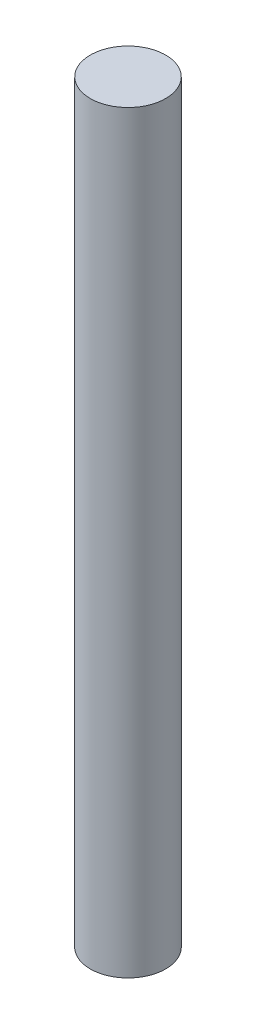
ISO-10303-21;
HEADER;
FILE_DESCRIPTION(('STEP AP214'),'2;1');
FILE_NAME('part.step','',(''),(''),'','','');
FILE_SCHEMA(('AUTOMOTIVE_DESIGN { 1 0 10303 214 1 1 1 1 }'));
ENDSEC;
DATA;
#1=APPLICATION_CONTEXT('core data for automotive mechanical design processes');
#2=APPLICATION_PROTOCOL_DEFINITION('international standard','automotive_design',2000,#1);
#3=PRODUCT_CONTEXT('',#1,'mechanical');
#4=PRODUCT('Part','Part','',(#3));
#5=PRODUCT_RELATED_PRODUCT_CATEGORY('part','',(#4));
#6=PRODUCT_DEFINITION_FORMATION('','',#4);
#7=PRODUCT_DEFINITION_CONTEXT('part definition',#1,'design');
#8=PRODUCT_DEFINITION('design','',#6,#7);
#9=PRODUCT_DEFINITION_SHAPE('','',#8);
#10=(LENGTH_UNIT() NAMED_UNIT(*) SI_UNIT(.MILLI.,.METRE.));
#11=(NAMED_UNIT(*) PLANE_ANGLE_UNIT() SI_UNIT($,.RADIAN.));
#12=(NAMED_UNIT(*) SI_UNIT($,.STERADIAN.) SOLID_ANGLE_UNIT());
#13=UNCERTAINTY_MEASURE_WITH_UNIT(LENGTH_MEASURE(1.E-05),#10,'distance_accuracy_value','');
#14=(GEOMETRIC_REPRESENTATION_CONTEXT(3) GLOBAL_UNCERTAINTY_ASSIGNED_CONTEXT((#13)) GLOBAL_UNIT_ASSIGNED_CONTEXT((#10,
#11,#12)) REPRESENTATION_CONTEXT('',''));
#15=CARTESIAN_POINT('',(0.,0.,0.));
#16=DIRECTION('',(0.,0.,1.));
#17=DIRECTION('',(1.,0.,0.));
#18=AXIS2_PLACEMENT_3D('',#15,#16,#17);
#19=CARTESIAN_POINT('',(0.,300.,0.));
#20=DIRECTION('',(0.,-1.,0.));
#21=DIRECTION('',(0.,0.,-1.));
#22=AXIS2_PLACEMENT_3D('',#19,#20,#21);
#23=CYLINDRICAL_SURFACE('',#22,15.);
#24=CARTESIAN_POINT('',(0.,300.,0.));
#25=DIRECTION('',(0.,1.,0.));
#26=DIRECTION('',(0.,0.,1.));
#27=AXIS2_PLACEMENT_3D('',#24,#25,#26);
#28=CIRCLE('',#27,15.);
#29=CARTESIAN_POINT('',(0.,300.,15.));
#30=VERTEX_POINT('',#29);
#31=EDGE_CURVE('E12',#30,#30,#28,.T.);
#32=ORIENTED_EDGE('',*,*,#31,.F.);
#33=EDGE_LOOP('',(#32));
#34=FACE_BOUND('',#33,.T.);
#35=CARTESIAN_POINT('',(0.,0.,0.));
#36=DIRECTION('',(0.,1.,0.));
#37=DIRECTION('',(0.,0.,1.));
#38=AXIS2_PLACEMENT_3D('',#35,#36,#37);
#39=CIRCLE('',#38,15.);
#40=CARTESIAN_POINT('',(0.,0.,15.));
#41=VERTEX_POINT('',#40);
#42=EDGE_CURVE('E45',#41,#41,#39,.T.);
#43=ORIENTED_EDGE('',*,*,#42,.T.);
#44=EDGE_LOOP('',(#43));
#45=FACE_BOUND('',#44,.T.);
#46=ADVANCED_FACE('F42',(#34,#45),#23,.T.);
#47=CARTESIAN_POINT('',(0.,300.,0.));
#48=DIRECTION('',(0.,1.,0.));
#49=DIRECTION('',(0.,0.,1.));
#50=AXIS2_PLACEMENT_3D('',#47,#48,#49);
#51=PLANE('',#50);
#52=ORIENTED_EDGE('',*,*,#31,.T.);
#53=EDGE_LOOP('',(#52));
#54=FACE_BOUND('',#53,.T.);
#55=ADVANCED_FACE('F63',(#54),#51,.T.);
#56=CARTESIAN_POINT('',(0.,0.,0.));
#57=DIRECTION('',(0.,1.,0.));
#58=DIRECTION('',(0.,0.,1.));
#59=AXIS2_PLACEMENT_3D('',#56,#57,#58);
#60=PLANE('',#59);
#61=ORIENTED_EDGE('',*,*,#42,.F.);
#62=EDGE_LOOP('',(#61));
#63=FACE_BOUND('',#62,.T.);
#64=ADVANCED_FACE('F61',(#63),#60,.F.);
#65=CLOSED_SHELL('',(#46,#55,#64));
#66=MANIFOLD_SOLID_BREP('B2',#65);
#67=ADVANCED_BREP_SHAPE_REPRESENTATION('',(#18,#66),#14);
#68=SHAPE_DEFINITION_REPRESENTATION(#9,#67);
ENDSEC;
END-ISO-10303-21;
